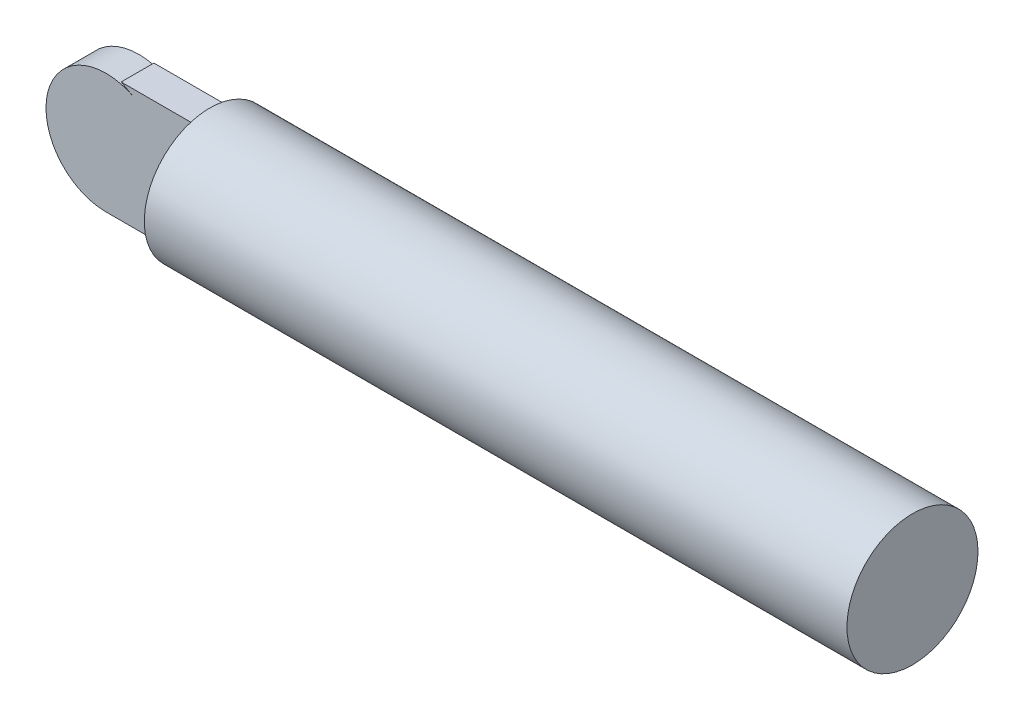
ISO-10303-21;
HEADER;
FILE_DESCRIPTION(('STEP AP214'),'2;1');
FILE_NAME('part.step','',(''),(''),'','','');
FILE_SCHEMA(('AUTOMOTIVE_DESIGN { 1 0 10303 214 1 1 1 1 }'));
ENDSEC;
DATA;
#1=APPLICATION_CONTEXT('core data for automotive mechanical design processes');
#2=APPLICATION_PROTOCOL_DEFINITION('international standard','automotive_design',2000,#1);
#3=PRODUCT_CONTEXT('',#1,'mechanical');
#4=PRODUCT('Part','Part','',(#3));
#5=PRODUCT_RELATED_PRODUCT_CATEGORY('part','',(#4));
#6=PRODUCT_DEFINITION_FORMATION('','',#4);
#7=PRODUCT_DEFINITION_CONTEXT('part definition',#1,'design');
#8=PRODUCT_DEFINITION('design','',#6,#7);
#9=PRODUCT_DEFINITION_SHAPE('','',#8);
#10=(LENGTH_UNIT() NAMED_UNIT(*) SI_UNIT(.MILLI.,.METRE.));
#11=(NAMED_UNIT(*) PLANE_ANGLE_UNIT() SI_UNIT($,.RADIAN.));
#12=(NAMED_UNIT(*) SI_UNIT($,.STERADIAN.) SOLID_ANGLE_UNIT());
#13=UNCERTAINTY_MEASURE_WITH_UNIT(LENGTH_MEASURE(1.E-05),#10,'distance_accuracy_value','');
#14=(GEOMETRIC_REPRESENTATION_CONTEXT(3) GLOBAL_UNCERTAINTY_ASSIGNED_CONTEXT((#13)) GLOBAL_UNIT_ASSIGNED_CONTEXT((#10,
#11,#12)) REPRESENTATION_CONTEXT('',''));
#15=CARTESIAN_POINT('',(0.,0.,0.));
#16=DIRECTION('',(0.,0.,1.));
#17=DIRECTION('',(1.,0.,0.));
#18=AXIS2_PLACEMENT_3D('',#15,#16,#17);
#19=CARTESIAN_POINT('',(63.4767985741635,0.,1.5));
#20=DIRECTION('',(0.,0.,-1.));
#21=DIRECTION('',(-1.,0.,0.));
#22=AXIS2_PLACEMENT_3D('',#19,#20,#21);
#23=CYLINDRICAL_SURFACE('',#22,5.50000000000002);
#24=CARTESIAN_POINT('',(63.4767985741635,0.,-1.5));
#25=DIRECTION('',(0.,0.,1.));
#26=DIRECTION('',(1.,0.,0.));
#27=AXIS2_PLACEMENT_3D('',#24,#25,#26);
#28=CIRCLE('',#27,5.50000000000002);
#29=CARTESIAN_POINT('',(66.0748747855168,4.84767985741633,-1.5));
#30=VERTEX_POINT('',#29);
#31=CARTESIAN_POINT('',(63.4767985741635,-5.5,-1.5));
#32=VERTEX_POINT('',#31);
#33=EDGE_CURVE('E108',#30,#32,#28,.T.);
#34=ORIENTED_EDGE('',*,*,#33,.T.);
#35=DIRECTION('',(0.,0.,-1.));
#36=VECTOR('',#35,1.);
#37=CARTESIAN_POINT('',(63.4767985741635,-5.5,1.5));
#38=LINE('',#37,#36);
#39=CARTESIAN_POINT('',(63.4767985741635,-5.5,1.5));
#40=VERTEX_POINT('',#39);
#41=EDGE_CURVE('E52',#40,#32,#38,.T.);
#42=ORIENTED_EDGE('',*,*,#41,.F.);
#43=CARTESIAN_POINT('',(63.4767985741635,0.,1.5));
#44=DIRECTION('',(0.,0.,1.));
#45=DIRECTION('',(1.,0.,0.));
#46=AXIS2_PLACEMENT_3D('',#43,#44,#45);
#47=CIRCLE('',#46,5.50000000000002);
#48=CARTESIAN_POINT('',(66.0748747855168,4.84767985741633,1.5));
#49=VERTEX_POINT('',#48);
#50=EDGE_CURVE('E92',#49,#40,#47,.T.);
#51=ORIENTED_EDGE('',*,*,#50,.F.);
#52=DIRECTION('',(0.,0.,-1.));
#53=VECTOR('',#52,1.);
#54=CARTESIAN_POINT('',(66.0748747855168,4.84767985741633,1.5));
#55=LINE('',#54,#53);
#56=EDGE_CURVE('E120',#49,#30,#55,.T.);
#57=ORIENTED_EDGE('',*,*,#56,.T.);
#58=EDGE_LOOP('',(#34,#42,#51,#57));
#59=FACE_BOUND('',#58,.T.);
#60=ADVANCED_FACE('F44',(#59),#23,.T.);
#61=CARTESIAN_POINT('',(0.,-5.5,1.5));
#62=DIRECTION('',(0.,-1.,0.));
#63=DIRECTION('',(1.,0.,0.));
#64=AXIS2_PLACEMENT_3D('',#61,#62,#63);
#65=PLANE('',#64);
#66=DIRECTION('',(-1.,0.,0.));
#67=VECTOR('',#66,1.);
#68=CARTESIAN_POINT('',(0.,-5.5,-1.5));
#69=LINE('',#68,#67);
#70=CARTESIAN_POINT('',(71.4767985741635,-5.5,-1.5));
#71=VERTEX_POINT('',#70);
#72=EDGE_CURVE('E122',#71,#32,#69,.T.);
#73=ORIENTED_EDGE('',*,*,#72,.F.);
#74=DIRECTION('',(0.,0.,-1.));
#75=VECTOR('',#74,1.);
#76=CARTESIAN_POINT('',(71.4767985741635,-5.5,1.5));
#77=LINE('',#76,#75);
#78=CARTESIAN_POINT('',(71.4767985741635,-5.5,1.5));
#79=VERTEX_POINT('',#78);
#80=EDGE_CURVE('E110',#79,#71,#77,.T.);
#81=ORIENTED_EDGE('',*,*,#80,.F.);
#82=DIRECTION('',(-1.,0.,0.));
#83=VECTOR('',#82,1.);
#84=CARTESIAN_POINT('',(0.,-5.5,1.5));
#85=LINE('',#84,#83);
#86=EDGE_CURVE('E96',#79,#40,#85,.T.);
#87=ORIENTED_EDGE('',*,*,#86,.T.);
#88=ORIENTED_EDGE('',*,*,#41,.T.);
#89=EDGE_LOOP('',(#73,#81,#87,#88));
#90=FACE_BOUND('',#89,.T.);
#91=ADVANCED_FACE('F112',(#90),#65,.T.);
#92=CARTESIAN_POINT('',(0.,5.5,1.5));
#93=DIRECTION('',(0.,1.,0.));
#94=DIRECTION('',(-1.,0.,0.));
#95=AXIS2_PLACEMENT_3D('',#92,#93,#94);
#96=PLANE('',#95);
#97=DIRECTION('',(1.,0.,0.));
#98=VECTOR('',#97,1.);
#99=CARTESIAN_POINT('',(0.,5.5,-1.5));
#100=LINE('',#99,#98);
#101=CARTESIAN_POINT('',(64.8577283438646,5.5,-1.5));
#102=VERTEX_POINT('',#101);
#103=CARTESIAN_POINT('',(71.4767985741635,5.5,-1.5));
#104=VERTEX_POINT('',#103);
#105=EDGE_CURVE('E126',#102,#104,#100,.T.);
#106=ORIENTED_EDGE('',*,*,#105,.F.);
#107=DIRECTION('',(0.,0.,-1.));
#108=VECTOR('',#107,1.);
#109=CARTESIAN_POINT('',(64.8577283438646,5.5,1.5));
#110=LINE('',#109,#108);
#111=CARTESIAN_POINT('',(64.8577283438646,5.5,1.5));
#112=VERTEX_POINT('',#111);
#113=EDGE_CURVE('E130',#112,#102,#110,.T.);
#114=ORIENTED_EDGE('',*,*,#113,.F.);
#115=DIRECTION('',(1.,0.,0.));
#116=VECTOR('',#115,1.);
#117=CARTESIAN_POINT('',(0.,5.5,1.5));
#118=LINE('',#117,#116);
#119=CARTESIAN_POINT('',(71.4767985741635,5.5,1.5));
#120=VERTEX_POINT('',#119);
#121=EDGE_CURVE('E114',#112,#120,#118,.T.);
#122=ORIENTED_EDGE('',*,*,#121,.T.);
#123=DIRECTION('',(0.,0.,-1.));
#124=VECTOR('',#123,1.);
#125=CARTESIAN_POINT('',(71.4767985741635,5.5,1.5));
#126=LINE('',#125,#124);
#127=EDGE_CURVE('E132',#120,#104,#126,.T.);
#128=ORIENTED_EDGE('',*,*,#127,.T.);
#129=EDGE_LOOP('',(#106,#114,#122,#128));
#130=FACE_BOUND('',#129,.T.);
#131=ADVANCED_FACE('F150',(#130),#96,.T.);
#132=CARTESIAN_POINT('',(16.7623205212905,31.2763587147776,1.5));
#133=DIRECTION('',(0.472377492973329,0.88139633771206,0.));
#134=DIRECTION('',(-0.881396337712061,0.472377492973329,0.));
#135=AXIS2_PLACEMENT_3D('',#132,#133,#134);
#136=PLANE('',#135);
#137=DIRECTION('',(0.88139633771206,-0.472377492973329,0.));
#138=VECTOR('',#137,1.);
#139=CARTESIAN_POINT('',(16.7623205212905,31.2763587147776,-1.5));
#140=LINE('',#139,#138);
#141=EDGE_CURVE('E104',#102,#30,#140,.T.);
#142=ORIENTED_EDGE('',*,*,#141,.T.);
#143=ORIENTED_EDGE('',*,*,#56,.F.);
#144=DIRECTION('',(0.88139633771206,-0.472377492973329,0.));
#145=VECTOR('',#144,1.);
#146=CARTESIAN_POINT('',(16.7623205212905,31.2763587147776,1.5));
#147=LINE('',#146,#145);
#148=EDGE_CURVE('E100',#112,#49,#147,.T.);
#149=ORIENTED_EDGE('',*,*,#148,.F.);
#150=ORIENTED_EDGE('',*,*,#113,.T.);
#151=EDGE_LOOP('',(#142,#143,#149,#150));
#152=FACE_BOUND('',#151,.T.);
#153=ADVANCED_FACE('F153',(#152),#136,.F.);
#154=CARTESIAN_POINT('',(0.,0.,1.5));
#155=DIRECTION('',(0.,0.,1.));
#156=DIRECTION('',(1.,0.,0.));
#157=AXIS2_PLACEMENT_3D('',#154,#155,#156);
#158=PLANE('',#157);
#159=ORIENTED_EDGE('',*,*,#50,.T.);
#160=ORIENTED_EDGE('',*,*,#86,.F.);
#161=DIRECTION('',(0.,-1.,0.));
#162=VECTOR('',#161,1.);
#163=CARTESIAN_POINT('',(71.4767985741635,0.,1.5));
#164=LINE('',#163,#162);
#165=EDGE_CURVE('E67',#120,#79,#164,.T.);
#166=ORIENTED_EDGE('',*,*,#165,.F.);
#167=ORIENTED_EDGE('',*,*,#121,.F.);
#168=ORIENTED_EDGE('',*,*,#148,.T.);
#169=EDGE_LOOP('',(#159,#160,#166,#167,#168));
#170=FACE_BOUND('',#169,.T.);
#171=ADVANCED_FACE('F94',(#170),#158,.T.);
#172=CARTESIAN_POINT('',(0.,0.,-1.5));
#173=DIRECTION('',(0.,0.,1.));
#174=DIRECTION('',(1.,0.,0.));
#175=AXIS2_PLACEMENT_3D('',#172,#173,#174);
#176=PLANE('',#175);
#177=ORIENTED_EDGE('',*,*,#33,.F.);
#178=ORIENTED_EDGE('',*,*,#141,.F.);
#179=ORIENTED_EDGE('',*,*,#105,.T.);
#180=DIRECTION('',(0.,-1.,0.));
#181=VECTOR('',#180,1.);
#182=CARTESIAN_POINT('',(71.4767985741635,0.,-1.5));
#183=LINE('',#182,#181);
#184=EDGE_CURVE('E59',#104,#71,#183,.T.);
#185=ORIENTED_EDGE('',*,*,#184,.T.);
#186=ORIENTED_EDGE('',*,*,#72,.T.);
#187=EDGE_LOOP('',(#177,#178,#179,#185,#186));
#188=FACE_BOUND('',#187,.T.);
#189=ADVANCED_FACE('F146',(#188),#176,.F.);
#190=CARTESIAN_POINT('',(71.4767985741635,0.,0.));
#191=DIRECTION('',(-1.,0.,0.));
#192=DIRECTION('',(0.,-1.,0.));
#193=AXIS2_PLACEMENT_3D('',#190,#191,#192);
#194=PLANE('',#193);
#195=CARTESIAN_POINT('',(71.4767985741635,0.,0.));
#196=DIRECTION('',(1.,0.,0.));
#197=DIRECTION('',(0.,0.,-1.));
#198=AXIS2_PLACEMENT_3D('',#195,#196,#197);
#199=CIRCLE('',#198,6.);
#200=CARTESIAN_POINT('',(71.4767985741635,0.,-6.));
#201=VERTEX_POINT('',#200);
#202=EDGE_CURVE('E12',#201,#201,#199,.T.);
#203=ORIENTED_EDGE('',*,*,#202,.F.);
#204=EDGE_LOOP('',(#203));
#205=FACE_BOUND('',#204,.T.);
#206=ORIENTED_EDGE('',*,*,#184,.F.);
#207=ORIENTED_EDGE('',*,*,#127,.F.);
#208=ORIENTED_EDGE('',*,*,#165,.T.);
#209=ORIENTED_EDGE('',*,*,#80,.T.);
#210=EDGE_LOOP('',(#206,#207,#208,#209));
#211=FACE_BOUND('',#210,.T.);
#212=ADVANCED_FACE('F142',(#205,#211),#194,.T.);
#213=CARTESIAN_POINT('',(143.476798574163,0.,0.));
#214=DIRECTION('',(1.,0.,0.));
#215=DIRECTION('',(0.,1.,0.));
#216=AXIS2_PLACEMENT_3D('',#213,#214,#215);
#217=CYLINDRICAL_SURFACE('',#216,6.);
#218=CARTESIAN_POINT('',(135.820798407567,0.,0.));
#219=DIRECTION('',(-1.,0.,0.));
#220=DIRECTION('',(0.,-1.,0.));
#221=AXIS2_PLACEMENT_3D('',#218,#219,#220);
#222=CIRCLE('',#221,6.);
#223=CARTESIAN_POINT('',(135.820798407567,-5.99999999999999,0.));
#224=VERTEX_POINT('',#223);
#225=EDGE_CURVE('E123',#224,#224,#222,.F.);
#226=ORIENTED_EDGE('',*,*,#225,.F.);
#227=EDGE_LOOP('',(#226));
#228=FACE_BOUND('',#227,.T.);
#229=ORIENTED_EDGE('',*,*,#202,.T.);
#230=EDGE_LOOP('',(#229));
#231=FACE_BOUND('',#230,.T.);
#232=ADVANCED_FACE('F46',(#228,#231),#217,.T.);
#233=CARTESIAN_POINT('',(135.820798407567,0.,0.));
#234=DIRECTION('',(-1.,0.,0.));
#235=DIRECTION('',(0.,-1.,0.));
#236=AXIS2_PLACEMENT_3D('',#233,#234,#235);
#237=PLANE('',#236);
#238=ORIENTED_EDGE('',*,*,#225,.T.);
#239=EDGE_LOOP('',(#238));
#240=FACE_BOUND('',#239,.T.);
#241=ADVANCED_FACE('F138',(#240),#237,.F.);
#242=CLOSED_SHELL('',(#60,#91,#131,#153,#171,#189,#212,#232,#241));
#243=MANIFOLD_SOLID_BREP('B2',#242);
#244=ADVANCED_BREP_SHAPE_REPRESENTATION('',(#18,#243),#14);
#245=SHAPE_DEFINITION_REPRESENTATION(#9,#244);
ENDSEC;
END-ISO-10303-21;
